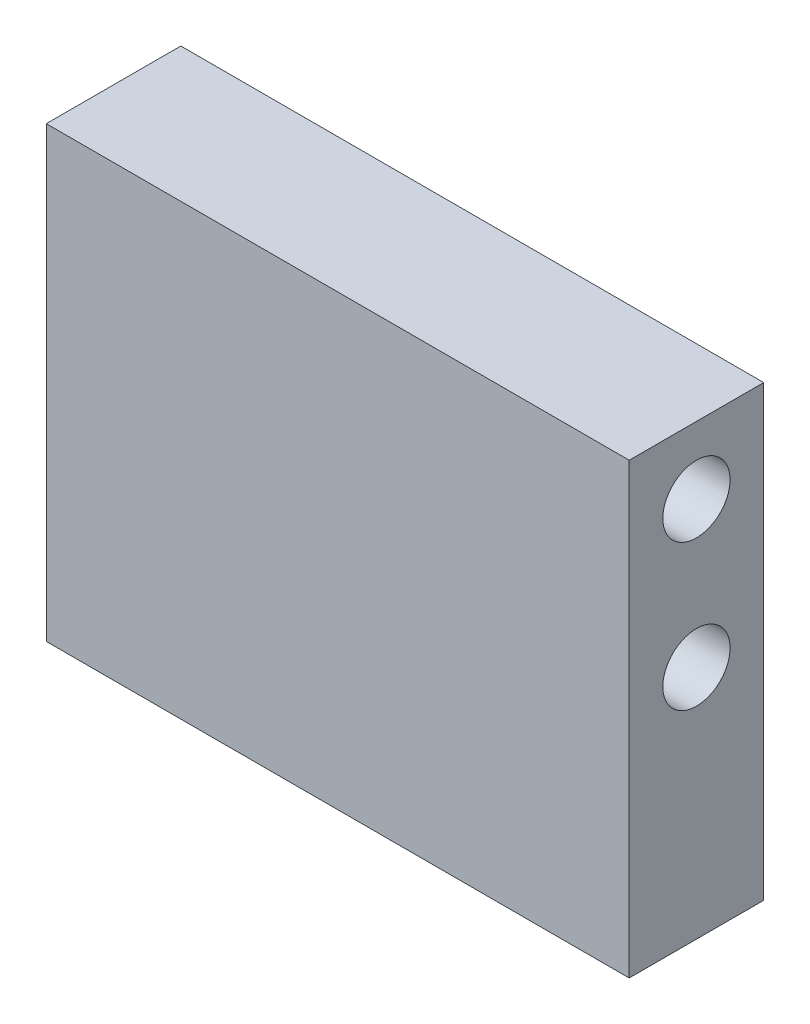
ISO-10303-21;
HEADER;
FILE_DESCRIPTION(('STEP AP214'),'2;1');
FILE_NAME('part.step','',(''),(''),'','','');
FILE_SCHEMA(('AUTOMOTIVE_DESIGN { 1 0 10303 214 1 1 1 1 }'));
ENDSEC;
DATA;
#1=APPLICATION_CONTEXT('core data for automotive mechanical design processes');
#2=APPLICATION_PROTOCOL_DEFINITION('international standard','automotive_design',2000,#1);
#3=PRODUCT_CONTEXT('',#1,'mechanical');
#4=PRODUCT('Part','Part','',(#3));
#5=PRODUCT_RELATED_PRODUCT_CATEGORY('part','',(#4));
#6=PRODUCT_DEFINITION_FORMATION('','',#4);
#7=PRODUCT_DEFINITION_CONTEXT('part definition',#1,'design');
#8=PRODUCT_DEFINITION('design','',#6,#7);
#9=PRODUCT_DEFINITION_SHAPE('','',#8);
#10=(LENGTH_UNIT() NAMED_UNIT(*) SI_UNIT(.MILLI.,.METRE.));
#11=(NAMED_UNIT(*) PLANE_ANGLE_UNIT() SI_UNIT($,.RADIAN.));
#12=(NAMED_UNIT(*) SI_UNIT($,.STERADIAN.) SOLID_ANGLE_UNIT());
#13=UNCERTAINTY_MEASURE_WITH_UNIT(LENGTH_MEASURE(1.E-05),#10,'distance_accuracy_value','');
#14=(GEOMETRIC_REPRESENTATION_CONTEXT(3) GLOBAL_UNCERTAINTY_ASSIGNED_CONTEXT((#13)) GLOBAL_UNIT_ASSIGNED_CONTEXT((#10,
#11,#12)) REPRESENTATION_CONTEXT('',''));
#15=CARTESIAN_POINT('',(0.,0.,0.));
#16=DIRECTION('',(0.,0.,1.));
#17=DIRECTION('',(1.,0.,0.));
#18=AXIS2_PLACEMENT_3D('',#15,#16,#17);
#19=CARTESIAN_POINT('',(-26.,-20.,12.));
#20=DIRECTION('',(1.,0.,0.));
#21=DIRECTION('',(0.,0.,-1.));
#22=AXIS2_PLACEMENT_3D('',#19,#20,#21);
#23=PLANE('',#22);
#24=CARTESIAN_POINT('',(-26.,14.,6.));
#25=DIRECTION('',(-1.,0.,0.));
#26=DIRECTION('',(0.,0.,1.));
#27=AXIS2_PLACEMENT_3D('',#24,#25,#26);
#28=CIRCLE('',#27,3.);
#29=CARTESIAN_POINT('',(-26.,14.,9.));
#30=VERTEX_POINT('',#29);
#31=EDGE_CURVE('E108',#30,#30,#28,.T.);
#32=ORIENTED_EDGE('',*,*,#31,.F.);
#33=EDGE_LOOP('',(#32));
#34=FACE_BOUND('',#33,.T.);
#35=CARTESIAN_POINT('',(-26.,0.99999999999999,6.));
#36=DIRECTION('',(-1.,0.,0.));
#37=DIRECTION('',(0.,0.,1.));
#38=AXIS2_PLACEMENT_3D('',#35,#36,#37);
#39=CIRCLE('',#38,3.);
#40=CARTESIAN_POINT('',(-26.,0.99999999999999,9.));
#41=VERTEX_POINT('',#40);
#42=EDGE_CURVE('E113',#41,#41,#39,.T.);
#43=ORIENTED_EDGE('',*,*,#42,.F.);
#44=EDGE_LOOP('',(#43));
#45=FACE_BOUND('',#44,.T.);
#46=DIRECTION('',(0.,-1.,0.));
#47=VECTOR('',#46,1.);
#48=CARTESIAN_POINT('',(-26.,-20.,0.));
#49=LINE('',#48,#47);
#50=CARTESIAN_POINT('',(-26.,20.,0.));
#51=VERTEX_POINT('',#50);
#52=CARTESIAN_POINT('',(-26.,-20.,0.));
#53=VERTEX_POINT('',#52);
#54=EDGE_CURVE('E99',#51,#53,#49,.T.);
#55=ORIENTED_EDGE('',*,*,#54,.T.);
#56=DIRECTION('',(0.,0.,-1.));
#57=VECTOR('',#56,1.);
#58=CARTESIAN_POINT('',(-26.,-20.,12.));
#59=LINE('',#58,#57);
#60=CARTESIAN_POINT('',(-26.,-20.,12.));
#61=VERTEX_POINT('',#60);
#62=EDGE_CURVE('E11',#61,#53,#59,.T.);
#63=ORIENTED_EDGE('',*,*,#62,.F.);
#64=DIRECTION('',(0.,-1.,0.));
#65=VECTOR('',#64,1.);
#66=CARTESIAN_POINT('',(-26.,-20.,12.));
#67=LINE('',#66,#65);
#68=CARTESIAN_POINT('',(-26.,20.,12.));
#69=VERTEX_POINT('',#68);
#70=EDGE_CURVE('E86',#69,#61,#67,.T.);
#71=ORIENTED_EDGE('',*,*,#70,.F.);
#72=DIRECTION('',(0.,0.,-1.));
#73=VECTOR('',#72,1.);
#74=CARTESIAN_POINT('',(-26.,20.,12.));
#75=LINE('',#74,#73);
#76=EDGE_CURVE('E95',#69,#51,#75,.T.);
#77=ORIENTED_EDGE('',*,*,#76,.T.);
#78=EDGE_LOOP('',(#55,#63,#71,#77));
#79=FACE_BOUND('',#78,.T.);
#80=ADVANCED_FACE('F33',(#34,#45,#79),#23,.F.);
#81=CARTESIAN_POINT('',(26.,-20.,12.));
#82=DIRECTION('',(0.,1.,0.));
#83=DIRECTION('',(-1.,0.,0.));
#84=AXIS2_PLACEMENT_3D('',#81,#82,#83);
#85=PLANE('',#84);
#86=DIRECTION('',(1.,0.,0.));
#87=VECTOR('',#86,1.);
#88=CARTESIAN_POINT('',(26.,-20.,0.));
#89=LINE('',#88,#87);
#90=CARTESIAN_POINT('',(26.,-20.,0.));
#91=VERTEX_POINT('',#90);
#92=EDGE_CURVE('E90',#53,#91,#89,.T.);
#93=ORIENTED_EDGE('',*,*,#92,.T.);
#94=DIRECTION('',(0.,0.,-1.));
#95=VECTOR('',#94,1.);
#96=CARTESIAN_POINT('',(26.,-20.,12.));
#97=LINE('',#96,#95);
#98=CARTESIAN_POINT('',(26.,-20.,12.));
#99=VERTEX_POINT('',#98);
#100=EDGE_CURVE('E42',#99,#91,#97,.T.);
#101=ORIENTED_EDGE('',*,*,#100,.F.);
#102=DIRECTION('',(1.,0.,0.));
#103=VECTOR('',#102,1.);
#104=CARTESIAN_POINT('',(26.,-20.,12.));
#105=LINE('',#104,#103);
#106=EDGE_CURVE('E81',#61,#99,#105,.T.);
#107=ORIENTED_EDGE('',*,*,#106,.F.);
#108=ORIENTED_EDGE('',*,*,#62,.T.);
#109=EDGE_LOOP('',(#93,#101,#107,#108));
#110=FACE_BOUND('',#109,.T.);
#111=ADVANCED_FACE('F89',(#110),#85,.F.);
#112=CARTESIAN_POINT('',(26.,-20.,12.));
#113=DIRECTION('',(-1.,0.,0.));
#114=DIRECTION('',(0.,0.,1.));
#115=AXIS2_PLACEMENT_3D('',#112,#113,#114);
#116=PLANE('',#115);
#117=CARTESIAN_POINT('',(26.,14.,6.));
#118=DIRECTION('',(-1.,0.,0.));
#119=DIRECTION('',(0.,0.,1.));
#120=AXIS2_PLACEMENT_3D('',#117,#118,#119);
#121=CIRCLE('',#120,3.);
#122=CARTESIAN_POINT('',(26.,14.,9.));
#123=VERTEX_POINT('',#122);
#124=EDGE_CURVE('E36',#123,#123,#121,.T.);
#125=ORIENTED_EDGE('',*,*,#124,.T.);
#126=EDGE_LOOP('',(#125));
#127=FACE_BOUND('',#126,.T.);
#128=CARTESIAN_POINT('',(26.,0.99999999999999,6.));
#129=DIRECTION('',(-1.,0.,0.));
#130=DIRECTION('',(0.,0.,1.));
#131=AXIS2_PLACEMENT_3D('',#128,#129,#130);
#132=CIRCLE('',#131,3.);
#133=CARTESIAN_POINT('',(26.,0.99999999999999,9.));
#134=VERTEX_POINT('',#133);
#135=EDGE_CURVE('E106',#134,#134,#132,.T.);
#136=ORIENTED_EDGE('',*,*,#135,.T.);
#137=EDGE_LOOP('',(#136));
#138=FACE_BOUND('',#137,.T.);
#139=DIRECTION('',(0.,1.,0.));
#140=VECTOR('',#139,1.);
#141=CARTESIAN_POINT('',(26.,-20.,0.));
#142=LINE('',#141,#140);
#143=CARTESIAN_POINT('',(26.,20.,0.));
#144=VERTEX_POINT('',#143);
#145=EDGE_CURVE('E68',#91,#144,#142,.T.);
#146=ORIENTED_EDGE('',*,*,#145,.T.);
#147=DIRECTION('',(0.,0.,-1.));
#148=VECTOR('',#147,1.);
#149=CARTESIAN_POINT('',(26.,20.,12.));
#150=LINE('',#149,#148);
#151=CARTESIAN_POINT('',(26.,20.,12.));
#152=VERTEX_POINT('',#151);
#153=EDGE_CURVE('E91',#152,#144,#150,.T.);
#154=ORIENTED_EDGE('',*,*,#153,.F.);
#155=DIRECTION('',(0.,1.,0.));
#156=VECTOR('',#155,1.);
#157=CARTESIAN_POINT('',(26.,-20.,12.));
#158=LINE('',#157,#156);
#159=EDGE_CURVE('E84',#99,#152,#158,.T.);
#160=ORIENTED_EDGE('',*,*,#159,.F.);
#161=ORIENTED_EDGE('',*,*,#100,.T.);
#162=EDGE_LOOP('',(#146,#154,#160,#161));
#163=FACE_BOUND('',#162,.T.);
#164=ADVANCED_FACE('F93',(#127,#138,#163),#116,.F.);
#165=CARTESIAN_POINT('',(26.,20.,12.));
#166=DIRECTION('',(0.,-1.,0.));
#167=DIRECTION('',(1.,0.,0.));
#168=AXIS2_PLACEMENT_3D('',#165,#166,#167);
#169=PLANE('',#168);
#170=DIRECTION('',(-1.,0.,0.));
#171=VECTOR('',#170,1.);
#172=CARTESIAN_POINT('',(26.,20.,0.));
#173=LINE('',#172,#171);
#174=EDGE_CURVE('E74',#144,#51,#173,.T.);
#175=ORIENTED_EDGE('',*,*,#174,.T.);
#176=ORIENTED_EDGE('',*,*,#76,.F.);
#177=DIRECTION('',(-1.,0.,0.));
#178=VECTOR('',#177,1.);
#179=CARTESIAN_POINT('',(26.,20.,12.));
#180=LINE('',#179,#178);
#181=EDGE_CURVE('E51',#152,#69,#180,.T.);
#182=ORIENTED_EDGE('',*,*,#181,.F.);
#183=ORIENTED_EDGE('',*,*,#153,.T.);
#184=EDGE_LOOP('',(#175,#176,#182,#183));
#185=FACE_BOUND('',#184,.T.);
#186=ADVANCED_FACE('F138',(#185),#169,.F.);
#187=CARTESIAN_POINT('',(0.,0.,12.));
#188=DIRECTION('',(0.,0.,1.));
#189=DIRECTION('',(1.,0.,0.));
#190=AXIS2_PLACEMENT_3D('',#187,#188,#189);
#191=PLANE('',#190);
#192=ORIENTED_EDGE('',*,*,#70,.T.);
#193=ORIENTED_EDGE('',*,*,#106,.T.);
#194=ORIENTED_EDGE('',*,*,#159,.T.);
#195=ORIENTED_EDGE('',*,*,#181,.T.);
#196=EDGE_LOOP('',(#192,#193,#194,#195));
#197=FACE_BOUND('',#196,.T.);
#198=ADVANCED_FACE('F82',(#197),#191,.T.);
#199=CARTESIAN_POINT('',(0.,0.,0.));
#200=DIRECTION('',(0.,0.,1.));
#201=DIRECTION('',(1.,0.,0.));
#202=AXIS2_PLACEMENT_3D('',#199,#200,#201);
#203=PLANE('',#202);
#204=ORIENTED_EDGE('',*,*,#54,.F.);
#205=ORIENTED_EDGE('',*,*,#174,.F.);
#206=ORIENTED_EDGE('',*,*,#145,.F.);
#207=ORIENTED_EDGE('',*,*,#92,.F.);
#208=EDGE_LOOP('',(#204,#205,#206,#207));
#209=FACE_BOUND('',#208,.T.);
#210=ADVANCED_FACE('F129',(#209),#203,.F.);
#211=CARTESIAN_POINT('',(74.,0.99999999999999,6.));
#212=DIRECTION('',(-1.,0.,0.));
#213=DIRECTION('',(0.,0.,1.));
#214=AXIS2_PLACEMENT_3D('',#211,#212,#213);
#215=CYLINDRICAL_SURFACE('',#214,3.);
#216=ORIENTED_EDGE('',*,*,#42,.T.);
#217=EDGE_LOOP('',(#216));
#218=FACE_BOUND('',#217,.T.);
#219=ORIENTED_EDGE('',*,*,#135,.F.);
#220=EDGE_LOOP('',(#219));
#221=FACE_BOUND('',#220,.T.);
#222=ADVANCED_FACE('F121',(#218,#221),#215,.F.);
#223=CARTESIAN_POINT('',(74.,14.,6.));
#224=DIRECTION('',(-1.,0.,0.));
#225=DIRECTION('',(0.,0.,1.));
#226=AXIS2_PLACEMENT_3D('',#223,#224,#225);
#227=CYLINDRICAL_SURFACE('',#226,3.);
#228=ORIENTED_EDGE('',*,*,#31,.T.);
#229=EDGE_LOOP('',(#228));
#230=FACE_BOUND('',#229,.T.);
#231=ORIENTED_EDGE('',*,*,#124,.F.);
#232=EDGE_LOOP('',(#231));
#233=FACE_BOUND('',#232,.T.);
#234=ADVANCED_FACE('F136',(#230,#233),#227,.F.);
#235=CLOSED_SHELL('',(#80,#111,#164,#186,#198,#210,#222,#234));
#236=MANIFOLD_SOLID_BREP('B2',#235);
#237=ADVANCED_BREP_SHAPE_REPRESENTATION('',(#18,#236),#14);
#238=SHAPE_DEFINITION_REPRESENTATION(#9,#237);
ENDSEC;
END-ISO-10303-21;
